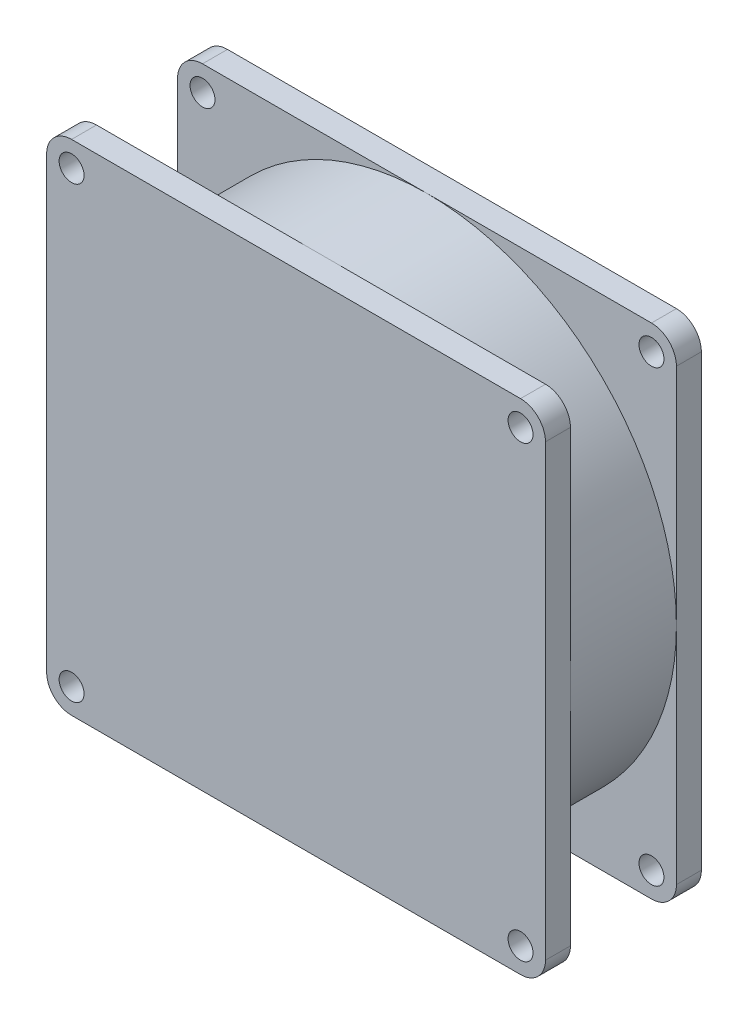
ISO-10303-21;
HEADER;
FILE_DESCRIPTION(('STEP AP214'),'2;1');
FILE_NAME('part.step','',(''),(''),'','','');
FILE_SCHEMA(('AUTOMOTIVE_DESIGN { 1 0 10303 214 1 1 1 1 }'));
ENDSEC;
DATA;
#1=APPLICATION_CONTEXT('core data for automotive mechanical design processes');
#2=APPLICATION_PROTOCOL_DEFINITION('international standard','automotive_design',2000,#1);
#3=PRODUCT_CONTEXT('',#1,'mechanical');
#4=PRODUCT('Part','Part','',(#3));
#5=PRODUCT_RELATED_PRODUCT_CATEGORY('part','',(#4));
#6=PRODUCT_DEFINITION_FORMATION('','',#4);
#7=PRODUCT_DEFINITION_CONTEXT('part definition',#1,'design');
#8=PRODUCT_DEFINITION('design','',#6,#7);
#9=PRODUCT_DEFINITION_SHAPE('','',#8);
#10=(LENGTH_UNIT() NAMED_UNIT(*) SI_UNIT(.MILLI.,.METRE.));
#11=(NAMED_UNIT(*) PLANE_ANGLE_UNIT() SI_UNIT($,.RADIAN.));
#12=(NAMED_UNIT(*) SI_UNIT($,.STERADIAN.) SOLID_ANGLE_UNIT());
#13=UNCERTAINTY_MEASURE_WITH_UNIT(LENGTH_MEASURE(1.E-05),#10,'distance_accuracy_value','');
#14=(GEOMETRIC_REPRESENTATION_CONTEXT(3) GLOBAL_UNCERTAINTY_ASSIGNED_CONTEXT((#13)) GLOBAL_UNIT_ASSIGNED_CONTEXT((#10,
#11,#12)) REPRESENTATION_CONTEXT('',''));
#15=CARTESIAN_POINT('',(0.,0.,0.));
#16=DIRECTION('',(0.,0.,1.));
#17=DIRECTION('',(1.,0.,0.));
#18=AXIS2_PLACEMENT_3D('',#15,#16,#17);
#19=CARTESIAN_POINT('',(0.,0.,4.));
#20=DIRECTION('',(0.,0.,1.));
#21=DIRECTION('',(1.,0.,0.));
#22=AXIS2_PLACEMENT_3D('',#19,#20,#21);
#23=PLANE('',#22);
#24=CARTESIAN_POINT('',(76.,76.,4.));
#25=DIRECTION('',(0.,0.,1.));
#26=DIRECTION('',(1.,0.,0.));
#27=AXIS2_PLACEMENT_3D('',#24,#25,#26);
#28=CIRCLE('',#27,1.99999999999999);
#29=CARTESIAN_POINT('',(78.,76.,4.));
#30=VERTEX_POINT('',#29);
#31=EDGE_CURVE('E41',#30,#30,#28,.T.);
#32=ORIENTED_EDGE('',*,*,#31,.F.);
#33=EDGE_LOOP('',(#32));
#34=FACE_BOUND('',#33,.T.);
#35=CARTESIAN_POINT('',(40.,40.,4.));
#36=DIRECTION('',(0.,0.,1.));
#37=DIRECTION('',(1.,0.,0.));
#38=AXIS2_PLACEMENT_3D('',#35,#36,#37);
#39=CIRCLE('',#38,40.);
#40=CARTESIAN_POINT('',(80.,40.,4.));
#41=VERTEX_POINT('',#40);
#42=CARTESIAN_POINT('',(40.,80.,4.));
#43=VERTEX_POINT('',#42);
#44=EDGE_CURVE('E212',#41,#43,#39,.T.);
#45=ORIENTED_EDGE('',*,*,#44,.F.);
#46=DIRECTION('',(0.,1.,0.));
#47=VECTOR('',#46,1.);
#48=CARTESIAN_POINT('',(80.,0.,4.));
#49=LINE('',#48,#47);
#50=CARTESIAN_POINT('',(80.,76.,4.));
#51=VERTEX_POINT('',#50);
#52=EDGE_CURVE('E230',#41,#51,#49,.T.);
#53=ORIENTED_EDGE('',*,*,#52,.T.);
#54=CARTESIAN_POINT('',(76.,76.,4.));
#55=DIRECTION('',(0.,0.,1.));
#56=DIRECTION('',(1.,0.,0.));
#57=AXIS2_PLACEMENT_3D('',#54,#55,#56);
#58=CIRCLE('',#57,4.);
#59=CARTESIAN_POINT('',(76.,80.,4.));
#60=VERTEX_POINT('',#59);
#61=EDGE_CURVE('E271',#51,#60,#58,.T.);
#62=ORIENTED_EDGE('',*,*,#61,.T.);
#63=DIRECTION('',(1.,0.,0.));
#64=VECTOR('',#63,1.);
#65=CARTESIAN_POINT('',(0.,80.,4.));
#66=LINE('',#65,#64);
#67=EDGE_CURVE('E234',#43,#60,#66,.T.);
#68=ORIENTED_EDGE('',*,*,#67,.F.);
#69=EDGE_LOOP('',(#45,#53,#62,#68));
#70=FACE_BOUND('',#69,.T.);
#71=ADVANCED_FACE('F37',(#34,#70),#23,.T.);
#72=CARTESIAN_POINT('',(4.,76.,4.));
#73=DIRECTION('',(0.,0.,1.));
#74=DIRECTION('',(1.,0.,0.));
#75=AXIS2_PLACEMENT_3D('',#72,#73,#74);
#76=CIRCLE('',#75,2.);
#77=CARTESIAN_POINT('',(5.99999999999999,76.,4.));
#78=VERTEX_POINT('',#77);
#79=EDGE_CURVE('E330',#78,#78,#76,.T.);
#80=ORIENTED_EDGE('',*,*,#79,.F.);
#81=EDGE_LOOP('',(#80));
#82=FACE_BOUND('',#81,.T.);
#83=CARTESIAN_POINT('',(0.,40.,4.));
#84=VERTEX_POINT('',#83);
#85=EDGE_CURVE('E225',#43,#84,#39,.T.);
#86=ORIENTED_EDGE('',*,*,#85,.F.);
#87=CARTESIAN_POINT('',(4.,80.,4.));
#88=VERTEX_POINT('',#87);
#89=EDGE_CURVE('E235',#88,#43,#66,.T.);
#90=ORIENTED_EDGE('',*,*,#89,.F.);
#91=CARTESIAN_POINT('',(4.,76.,4.));
#92=DIRECTION('',(0.,0.,1.));
#93=DIRECTION('',(1.,0.,0.));
#94=AXIS2_PLACEMENT_3D('',#91,#92,#93);
#95=CIRCLE('',#94,4.);
#96=CARTESIAN_POINT('',(0.,76.,4.));
#97=VERTEX_POINT('',#96);
#98=EDGE_CURVE('E278',#88,#97,#95,.T.);
#99=ORIENTED_EDGE('',*,*,#98,.T.);
#100=DIRECTION('',(0.,1.,0.));
#101=VECTOR('',#100,1.);
#102=CARTESIAN_POINT('',(0.,0.,4.));
#103=LINE('',#102,#101);
#104=EDGE_CURVE('E238',#84,#97,#103,.T.);
#105=ORIENTED_EDGE('',*,*,#104,.F.);
#106=EDGE_LOOP('',(#86,#90,#99,#105));
#107=FACE_BOUND('',#106,.T.);
#108=ADVANCED_FACE('F418',(#82,#107),#23,.T.);
#109=CARTESIAN_POINT('',(4.,4.,4.));
#110=DIRECTION('',(0.,0.,1.));
#111=DIRECTION('',(1.,0.,0.));
#112=AXIS2_PLACEMENT_3D('',#109,#110,#111);
#113=CIRCLE('',#112,2.);
#114=CARTESIAN_POINT('',(5.99999999999999,4.,4.));
#115=VERTEX_POINT('',#114);
#116=EDGE_CURVE('E328',#115,#115,#113,.T.);
#117=ORIENTED_EDGE('',*,*,#116,.F.);
#118=EDGE_LOOP('',(#117));
#119=FACE_BOUND('',#118,.T.);
#120=CARTESIAN_POINT('',(40.,0.,4.));
#121=VERTEX_POINT('',#120);
#122=EDGE_CURVE('E459',#84,#121,#39,.T.);
#123=ORIENTED_EDGE('',*,*,#122,.F.);
#124=CARTESIAN_POINT('',(0.,4.,4.));
#125=VERTEX_POINT('',#124);
#126=EDGE_CURVE('E239',#125,#84,#103,.T.);
#127=ORIENTED_EDGE('',*,*,#126,.F.);
#128=CARTESIAN_POINT('',(4.,4.,4.));
#129=DIRECTION('',(0.,0.,1.));
#130=DIRECTION('',(1.,0.,0.));
#131=AXIS2_PLACEMENT_3D('',#128,#129,#130);
#132=CIRCLE('',#131,4.);
#133=CARTESIAN_POINT('',(4.,0.,4.));
#134=VERTEX_POINT('',#133);
#135=EDGE_CURVE('E276',#125,#134,#132,.T.);
#136=ORIENTED_EDGE('',*,*,#135,.T.);
#137=DIRECTION('',(1.,0.,0.));
#138=VECTOR('',#137,1.);
#139=CARTESIAN_POINT('',(0.,0.,4.));
#140=LINE('',#139,#138);
#141=EDGE_CURVE('E227',#134,#121,#140,.T.);
#142=ORIENTED_EDGE('',*,*,#141,.T.);
#143=EDGE_LOOP('',(#123,#127,#136,#142));
#144=FACE_BOUND('',#143,.T.);
#145=ADVANCED_FACE('F425',(#119,#144),#23,.T.);
#146=CARTESIAN_POINT('',(0.,0.,4.));
#147=DIRECTION('',(0.,1.,0.));
#148=DIRECTION('',(0.,0.,1.));
#149=AXIS2_PLACEMENT_3D('',#146,#147,#148);
#150=PLANE('',#149);
#151=ORIENTED_EDGE('',*,*,#141,.F.);
#152=DIRECTION('',(0.,0.,-1.));
#153=VECTOR('',#152,1.);
#154=CARTESIAN_POINT('',(4.,0.,0.));
#155=LINE('',#154,#153);
#156=CARTESIAN_POINT('',(4.,0.,0.));
#157=VERTEX_POINT('',#156);
#158=EDGE_CURVE('E284',#134,#157,#155,.T.);
#159=ORIENTED_EDGE('',*,*,#158,.T.);
#160=DIRECTION('',(1.,0.,0.));
#161=VECTOR('',#160,1.);
#162=CARTESIAN_POINT('',(0.,0.,0.));
#163=LINE('',#162,#161);
#164=CARTESIAN_POINT('',(76.,0.,0.));
#165=VERTEX_POINT('',#164);
#166=EDGE_CURVE('E205',#157,#165,#163,.T.);
#167=ORIENTED_EDGE('',*,*,#166,.T.);
#168=DIRECTION('',(0.,0.,-1.));
#169=VECTOR('',#168,1.);
#170=CARTESIAN_POINT('',(76.,0.,4.));
#171=LINE('',#170,#169);
#172=CARTESIAN_POINT('',(76.,0.,4.));
#173=VERTEX_POINT('',#172);
#174=EDGE_CURVE('E281',#165,#173,#171,.F.);
#175=ORIENTED_EDGE('',*,*,#174,.T.);
#176=EDGE_CURVE('E231',#121,#173,#140,.T.);
#177=ORIENTED_EDGE('',*,*,#176,.F.);
#178=EDGE_LOOP('',(#151,#159,#167,#175,#177));
#179=FACE_BOUND('',#178,.T.);
#180=ADVANCED_FACE('F447',(#179),#150,.F.);
#181=CARTESIAN_POINT('',(80.,0.,4.));
#182=DIRECTION('',(-1.,0.,0.));
#183=DIRECTION('',(0.,0.,1.));
#184=AXIS2_PLACEMENT_3D('',#181,#182,#183);
#185=PLANE('',#184);
#186=CARTESIAN_POINT('',(80.,4.,4.));
#187=VERTEX_POINT('',#186);
#188=EDGE_CURVE('E232',#187,#41,#49,.T.);
#189=ORIENTED_EDGE('',*,*,#188,.F.);
#190=DIRECTION('',(0.,0.,-1.));
#191=VECTOR('',#190,1.);
#192=CARTESIAN_POINT('',(80.,4.,4.));
#193=LINE('',#192,#191);
#194=CARTESIAN_POINT('',(80.,4.,0.));
#195=VERTEX_POINT('',#194);
#196=EDGE_CURVE('E290',#187,#195,#193,.T.);
#197=ORIENTED_EDGE('',*,*,#196,.T.);
#198=DIRECTION('',(0.,1.,0.));
#199=VECTOR('',#198,1.);
#200=CARTESIAN_POINT('',(80.,0.,0.));
#201=LINE('',#200,#199);
#202=CARTESIAN_POINT('',(80.,76.,0.));
#203=VERTEX_POINT('',#202);
#204=EDGE_CURVE('E245',#195,#203,#201,.T.);
#205=ORIENTED_EDGE('',*,*,#204,.T.);
#206=DIRECTION('',(0.,0.,-1.));
#207=VECTOR('',#206,1.);
#208=CARTESIAN_POINT('',(80.,76.,4.));
#209=LINE('',#208,#207);
#210=EDGE_CURVE('E287',#203,#51,#209,.F.);
#211=ORIENTED_EDGE('',*,*,#210,.T.);
#212=ORIENTED_EDGE('',*,*,#52,.F.);
#213=EDGE_LOOP('',(#189,#197,#205,#211,#212));
#214=FACE_BOUND('',#213,.T.);
#215=ADVANCED_FACE('F452',(#214),#185,.F.);
#216=CARTESIAN_POINT('',(0.,80.,4.));
#217=DIRECTION('',(0.,1.,0.));
#218=DIRECTION('',(0.,0.,1.));
#219=AXIS2_PLACEMENT_3D('',#216,#217,#218);
#220=PLANE('',#219);
#221=DIRECTION('',(1.,0.,0.));
#222=VECTOR('',#221,1.);
#223=CARTESIAN_POINT('',(0.,80.,0.));
#224=LINE('',#223,#222);
#225=CARTESIAN_POINT('',(4.,80.,0.));
#226=VERTEX_POINT('',#225);
#227=CARTESIAN_POINT('',(76.,80.,0.));
#228=VERTEX_POINT('',#227);
#229=EDGE_CURVE('E248',#226,#228,#224,.T.);
#230=ORIENTED_EDGE('',*,*,#229,.F.);
#231=DIRECTION('',(0.,0.,-1.));
#232=VECTOR('',#231,1.);
#233=CARTESIAN_POINT('',(4.,80.,4.));
#234=LINE('',#233,#232);
#235=EDGE_CURVE('E269',#226,#88,#234,.F.);
#236=ORIENTED_EDGE('',*,*,#235,.T.);
#237=ORIENTED_EDGE('',*,*,#89,.T.);
#238=ORIENTED_EDGE('',*,*,#67,.T.);
#239=DIRECTION('',(0.,0.,-1.));
#240=VECTOR('',#239,1.);
#241=CARTESIAN_POINT('',(76.,80.,0.));
#242=LINE('',#241,#240);
#243=EDGE_CURVE('E266',#60,#228,#242,.T.);
#244=ORIENTED_EDGE('',*,*,#243,.T.);
#245=EDGE_LOOP('',(#230,#236,#237,#238,#244));
#246=FACE_BOUND('',#245,.T.);
#247=ADVANCED_FACE('F441',(#246),#220,.T.);
#248=CARTESIAN_POINT('',(0.,0.,4.));
#249=DIRECTION('',(-1.,0.,0.));
#250=DIRECTION('',(0.,0.,1.));
#251=AXIS2_PLACEMENT_3D('',#248,#249,#250);
#252=PLANE('',#251);
#253=ORIENTED_EDGE('',*,*,#126,.T.);
#254=ORIENTED_EDGE('',*,*,#104,.T.);
#255=DIRECTION('',(0.,0.,-1.));
#256=VECTOR('',#255,1.);
#257=CARTESIAN_POINT('',(0.,76.,4.));
#258=LINE('',#257,#256);
#259=CARTESIAN_POINT('',(0.,76.,0.));
#260=VERTEX_POINT('',#259);
#261=EDGE_CURVE('E255',#97,#260,#258,.T.);
#262=ORIENTED_EDGE('',*,*,#261,.T.);
#263=DIRECTION('',(0.,1.,0.));
#264=VECTOR('',#263,1.);
#265=CARTESIAN_POINT('',(0.,0.,0.));
#266=LINE('',#265,#264);
#267=CARTESIAN_POINT('',(0.,4.,0.));
#268=VERTEX_POINT('',#267);
#269=EDGE_CURVE('E251',#268,#260,#266,.T.);
#270=ORIENTED_EDGE('',*,*,#269,.F.);
#271=DIRECTION('',(0.,0.,-1.));
#272=VECTOR('',#271,1.);
#273=CARTESIAN_POINT('',(0.,4.,4.));
#274=LINE('',#273,#272);
#275=EDGE_CURVE('E242',#268,#125,#274,.F.);
#276=ORIENTED_EDGE('',*,*,#275,.T.);
#277=EDGE_LOOP('',(#253,#254,#262,#270,#276));
#278=FACE_BOUND('',#277,.T.);
#279=ADVANCED_FACE('F433',(#278),#252,.T.);
#280=CARTESIAN_POINT('',(76.,4.,4.));
#281=DIRECTION('',(0.,0.,1.));
#282=DIRECTION('',(1.,0.,0.));
#283=AXIS2_PLACEMENT_3D('',#280,#281,#282);
#284=CIRCLE('',#283,1.99999999999999);
#285=CARTESIAN_POINT('',(78.,4.,4.));
#286=VERTEX_POINT('',#285);
#287=EDGE_CURVE('E324',#286,#286,#284,.T.);
#288=ORIENTED_EDGE('',*,*,#287,.F.);
#289=EDGE_LOOP('',(#288));
#290=FACE_BOUND('',#289,.T.);
#291=EDGE_CURVE('E226',#121,#41,#39,.T.);
#292=ORIENTED_EDGE('',*,*,#291,.F.);
#293=ORIENTED_EDGE('',*,*,#176,.T.);
#294=CARTESIAN_POINT('',(76.,4.,4.));
#295=DIRECTION('',(0.,0.,1.));
#296=DIRECTION('',(1.,0.,0.));
#297=AXIS2_PLACEMENT_3D('',#294,#295,#296);
#298=CIRCLE('',#297,4.);
#299=EDGE_CURVE('E274',#173,#187,#298,.T.);
#300=ORIENTED_EDGE('',*,*,#299,.T.);
#301=ORIENTED_EDGE('',*,*,#188,.T.);
#302=EDGE_LOOP('',(#292,#293,#300,#301));
#303=FACE_BOUND('',#302,.T.);
#304=ADVANCED_FACE('F421',(#290,#303),#23,.T.);
#305=CARTESIAN_POINT('',(0.,0.,0.));
#306=DIRECTION('',(0.,0.,1.));
#307=DIRECTION('',(1.,0.,0.));
#308=AXIS2_PLACEMENT_3D('',#305,#306,#307);
#309=PLANE('',#308);
#310=CARTESIAN_POINT('',(76.,76.,0.));
#311=DIRECTION('',(0.,0.,-1.));
#312=DIRECTION('',(-1.,0.,0.));
#313=AXIS2_PLACEMENT_3D('',#310,#311,#312);
#314=CIRCLE('',#313,2.);
#315=CARTESIAN_POINT('',(74.,76.,0.));
#316=VERTEX_POINT('',#315);
#317=EDGE_CURVE('E578',#316,#316,#314,.T.);
#318=ORIENTED_EDGE('',*,*,#317,.F.);
#319=EDGE_LOOP('',(#318));
#320=FACE_BOUND('',#319,.T.);
#321=CARTESIAN_POINT('',(4.,76.,0.));
#322=DIRECTION('',(0.,0.,-1.));
#323=DIRECTION('',(-1.,0.,0.));
#324=AXIS2_PLACEMENT_3D('',#321,#322,#323);
#325=CIRCLE('',#324,2.);
#326=CARTESIAN_POINT('',(2.,76.,0.));
#327=VERTEX_POINT('',#326);
#328=EDGE_CURVE('E340',#327,#327,#325,.T.);
#329=ORIENTED_EDGE('',*,*,#328,.F.);
#330=EDGE_LOOP('',(#329));
#331=FACE_BOUND('',#330,.T.);
#332=CARTESIAN_POINT('',(4.,4.,0.));
#333=DIRECTION('',(0.,0.,-1.));
#334=DIRECTION('',(-1.,0.,0.));
#335=AXIS2_PLACEMENT_3D('',#332,#333,#334);
#336=CIRCLE('',#335,2.);
#337=CARTESIAN_POINT('',(2.,4.,0.));
#338=VERTEX_POINT('',#337);
#339=EDGE_CURVE('E337',#338,#338,#336,.T.);
#340=ORIENTED_EDGE('',*,*,#339,.F.);
#341=EDGE_LOOP('',(#340));
#342=FACE_BOUND('',#341,.T.);
#343=CARTESIAN_POINT('',(76.,4.,0.));
#344=DIRECTION('',(0.,0.,-1.));
#345=DIRECTION('',(-1.,0.,0.));
#346=AXIS2_PLACEMENT_3D('',#343,#344,#345);
#347=CIRCLE('',#346,2.);
#348=CARTESIAN_POINT('',(74.,4.,0.));
#349=VERTEX_POINT('',#348);
#350=EDGE_CURVE('E355',#349,#349,#347,.T.);
#351=ORIENTED_EDGE('',*,*,#350,.F.);
#352=EDGE_LOOP('',(#351));
#353=FACE_BOUND('',#352,.T.);
#354=ORIENTED_EDGE('',*,*,#269,.T.);
#355=CARTESIAN_POINT('',(4.,76.,0.));
#356=DIRECTION('',(0.,0.,1.));
#357=DIRECTION('',(1.,0.,0.));
#358=AXIS2_PLACEMENT_3D('',#355,#356,#357);
#359=CIRCLE('',#358,4.);
#360=EDGE_CURVE('E264',#260,#226,#359,.F.);
#361=ORIENTED_EDGE('',*,*,#360,.T.);
#362=ORIENTED_EDGE('',*,*,#229,.T.);
#363=CARTESIAN_POINT('',(76.,76.,0.));
#364=DIRECTION('',(0.,0.,1.));
#365=DIRECTION('',(1.,0.,0.));
#366=AXIS2_PLACEMENT_3D('',#363,#364,#365);
#367=CIRCLE('',#366,4.);
#368=EDGE_CURVE('E258',#228,#203,#367,.F.);
#369=ORIENTED_EDGE('',*,*,#368,.T.);
#370=ORIENTED_EDGE('',*,*,#204,.F.);
#371=CARTESIAN_POINT('',(76.,4.,0.));
#372=DIRECTION('',(0.,0.,1.));
#373=DIRECTION('',(1.,0.,0.));
#374=AXIS2_PLACEMENT_3D('',#371,#372,#373);
#375=CIRCLE('',#374,4.);
#376=EDGE_CURVE('E260',#195,#165,#375,.F.);
#377=ORIENTED_EDGE('',*,*,#376,.T.);
#378=ORIENTED_EDGE('',*,*,#166,.F.);
#379=CARTESIAN_POINT('',(4.,4.,0.));
#380=DIRECTION('',(0.,0.,1.));
#381=DIRECTION('',(1.,0.,0.));
#382=AXIS2_PLACEMENT_3D('',#379,#380,#381);
#383=CIRCLE('',#382,4.);
#384=EDGE_CURVE('E262',#157,#268,#383,.F.);
#385=ORIENTED_EDGE('',*,*,#384,.T.);
#386=EDGE_LOOP('',(#354,#361,#362,#369,#370,#377,#378,#385));
#387=FACE_BOUND('',#386,.T.);
#388=ADVANCED_FACE('F432',(#320,#331,#342,#353,#387),#309,.F.);
#389=CARTESIAN_POINT('',(4.,76.,4.));
#390=DIRECTION('',(0.,0.,-1.));
#391=DIRECTION('',(-1.,0.,0.));
#392=AXIS2_PLACEMENT_3D('',#389,#390,#391);
#393=CYLINDRICAL_SURFACE('',#392,4.);
#394=ORIENTED_EDGE('',*,*,#98,.F.);
#395=ORIENTED_EDGE('',*,*,#235,.F.);
#396=ORIENTED_EDGE('',*,*,#360,.F.);
#397=ORIENTED_EDGE('',*,*,#261,.F.);
#398=EDGE_LOOP('',(#394,#395,#396,#397));
#399=FACE_BOUND('',#398,.T.);
#400=ADVANCED_FACE('F439',(#399),#393,.T.);
#401=CARTESIAN_POINT('',(4.,4.,4.));
#402=DIRECTION('',(0.,0.,1.));
#403=DIRECTION('',(1.,0.,0.));
#404=AXIS2_PLACEMENT_3D('',#401,#402,#403);
#405=CYLINDRICAL_SURFACE('',#404,4.);
#406=ORIENTED_EDGE('',*,*,#135,.F.);
#407=ORIENTED_EDGE('',*,*,#275,.F.);
#408=ORIENTED_EDGE('',*,*,#384,.F.);
#409=ORIENTED_EDGE('',*,*,#158,.F.);
#410=EDGE_LOOP('',(#406,#407,#408,#409));
#411=FACE_BOUND('',#410,.T.);
#412=ADVANCED_FACE('F484',(#411),#405,.T.);
#413=CARTESIAN_POINT('',(76.,4.,4.));
#414=DIRECTION('',(0.,0.,-1.));
#415=DIRECTION('',(-1.,0.,0.));
#416=AXIS2_PLACEMENT_3D('',#413,#414,#415);
#417=CYLINDRICAL_SURFACE('',#416,4.);
#418=ORIENTED_EDGE('',*,*,#299,.F.);
#419=ORIENTED_EDGE('',*,*,#174,.F.);
#420=ORIENTED_EDGE('',*,*,#376,.F.);
#421=ORIENTED_EDGE('',*,*,#196,.F.);
#422=EDGE_LOOP('',(#418,#419,#420,#421));
#423=FACE_BOUND('',#422,.T.);
#424=ADVANCED_FACE('F496',(#423),#417,.T.);
#425=CARTESIAN_POINT('',(76.,76.,4.));
#426=DIRECTION('',(0.,0.,1.));
#427=DIRECTION('',(1.,0.,0.));
#428=AXIS2_PLACEMENT_3D('',#425,#426,#427);
#429=CYLINDRICAL_SURFACE('',#428,4.);
#430=ORIENTED_EDGE('',*,*,#61,.F.);
#431=ORIENTED_EDGE('',*,*,#210,.F.);
#432=ORIENTED_EDGE('',*,*,#368,.F.);
#433=ORIENTED_EDGE('',*,*,#243,.F.);
#434=EDGE_LOOP('',(#430,#431,#432,#433));
#435=FACE_BOUND('',#434,.T.);
#436=ADVANCED_FACE('F494',(#435),#429,.T.);
#437=CARTESIAN_POINT('',(40.,40.,21.));
#438=DIRECTION('',(0.,0.,-1.));
#439=DIRECTION('',(-1.,0.,0.));
#440=AXIS2_PLACEMENT_3D('',#437,#438,#439);
#441=CYLINDRICAL_SURFACE('',#440,40.);
#442=CARTESIAN_POINT('',(40.,40.,21.));
#443=DIRECTION('',(0.,0.,1.));
#444=DIRECTION('',(1.,0.,0.));
#445=AXIS2_PLACEMENT_3D('',#442,#443,#444);
#446=CIRCLE('',#445,40.);
#447=CARTESIAN_POINT('',(80.,40.,21.));
#448=VERTEX_POINT('',#447);
#449=CARTESIAN_POINT('',(40.,80.,21.));
#450=VERTEX_POINT('',#449);
#451=EDGE_CURVE('E194',#448,#450,#446,.T.);
#452=ORIENTED_EDGE('',*,*,#451,.F.);
#453=CARTESIAN_POINT('',(40.,0.,21.));
#454=VERTEX_POINT('',#453);
#455=EDGE_CURVE('E198',#454,#448,#446,.T.);
#456=ORIENTED_EDGE('',*,*,#455,.F.);
#457=CARTESIAN_POINT('',(0.,40.,21.));
#458=VERTEX_POINT('',#457);
#459=EDGE_CURVE('E211',#458,#454,#446,.T.);
#460=ORIENTED_EDGE('',*,*,#459,.F.);
#461=EDGE_CURVE('E201',#450,#458,#446,.T.);
#462=ORIENTED_EDGE('',*,*,#461,.F.);
#463=EDGE_LOOP('',(#452,#456,#460,#462));
#464=FACE_BOUND('',#463,.T.);
#465=ORIENTED_EDGE('',*,*,#44,.T.);
#466=ORIENTED_EDGE('',*,*,#85,.T.);
#467=ORIENTED_EDGE('',*,*,#122,.T.);
#468=ORIENTED_EDGE('',*,*,#291,.T.);
#469=EDGE_LOOP('',(#465,#466,#467,#468));
#470=FACE_BOUND('',#469,.T.);
#471=ADVANCED_FACE('F195',(#464,#470),#441,.T.);
#472=CARTESIAN_POINT('',(0.,0.,21.));
#473=DIRECTION('',(0.,0.,-1.));
#474=DIRECTION('',(-1.,0.,0.));
#475=AXIS2_PLACEMENT_3D('',#472,#473,#474);
#476=PLANE('',#475);
#477=CARTESIAN_POINT('',(76.,76.,21.));
#478=DIRECTION('',(0.,0.,-1.));
#479=DIRECTION('',(-1.,0.,0.));
#480=AXIS2_PLACEMENT_3D('',#477,#478,#479);
#481=CIRCLE('',#480,1.99999999999999);
#482=CARTESIAN_POINT('',(74.,76.,21.));
#483=VERTEX_POINT('',#482);
#484=EDGE_CURVE('E345',#483,#483,#481,.T.);
#485=ORIENTED_EDGE('',*,*,#484,.F.);
#486=EDGE_LOOP('',(#485));
#487=FACE_BOUND('',#486,.T.);
#488=DIRECTION('',(-1.,0.,0.));
#489=VECTOR('',#488,1.);
#490=CARTESIAN_POINT('',(0.,80.,21.));
#491=LINE('',#490,#489);
#492=CARTESIAN_POINT('',(76.,80.,21.));
#493=VERTEX_POINT('',#492);
#494=EDGE_CURVE('E219',#493,#450,#491,.T.);
#495=ORIENTED_EDGE('',*,*,#494,.F.);
#496=CARTESIAN_POINT('',(76.,76.,21.));
#497=DIRECTION('',(0.,0.,-1.));
#498=DIRECTION('',(-1.,0.,0.));
#499=AXIS2_PLACEMENT_3D('',#496,#497,#498);
#500=CIRCLE('',#499,4.);
#501=CARTESIAN_POINT('',(80.,76.,21.));
#502=VERTEX_POINT('',#501);
#503=EDGE_CURVE('E214',#493,#502,#500,.T.);
#504=ORIENTED_EDGE('',*,*,#503,.T.);
#505=DIRECTION('',(0.,1.,0.));
#506=VECTOR('',#505,1.);
#507=CARTESIAN_POINT('',(80.,0.,21.));
#508=LINE('',#507,#506);
#509=EDGE_CURVE('E182',#448,#502,#508,.T.);
#510=ORIENTED_EDGE('',*,*,#509,.F.);
#511=ORIENTED_EDGE('',*,*,#451,.T.);
#512=EDGE_LOOP('',(#495,#504,#510,#511));
#513=FACE_BOUND('',#512,.T.);
#514=ADVANCED_FACE('F213',(#487,#513),#476,.T.);
#515=CARTESIAN_POINT('',(4.,76.,21.));
#516=DIRECTION('',(0.,0.,-1.));
#517=DIRECTION('',(-1.,0.,0.));
#518=AXIS2_PLACEMENT_3D('',#515,#516,#517);
#519=CIRCLE('',#518,2.);
#520=CARTESIAN_POINT('',(2.,76.,21.));
#521=VERTEX_POINT('',#520);
#522=EDGE_CURVE('E332',#521,#521,#519,.T.);
#523=ORIENTED_EDGE('',*,*,#522,.F.);
#524=EDGE_LOOP('',(#523));
#525=FACE_BOUND('',#524,.T.);
#526=DIRECTION('',(0.,-1.,0.));
#527=VECTOR('',#526,1.);
#528=CARTESIAN_POINT('',(0.,0.,21.));
#529=LINE('',#528,#527);
#530=CARTESIAN_POINT('',(0.,76.,21.));
#531=VERTEX_POINT('',#530);
#532=EDGE_CURVE('E372',#531,#458,#529,.T.);
#533=ORIENTED_EDGE('',*,*,#532,.F.);
#534=CARTESIAN_POINT('',(4.,76.,21.));
#535=DIRECTION('',(0.,0.,-1.));
#536=DIRECTION('',(-1.,0.,0.));
#537=AXIS2_PLACEMENT_3D('',#534,#535,#536);
#538=CIRCLE('',#537,4.);
#539=CARTESIAN_POINT('',(4.,80.,21.));
#540=VERTEX_POINT('',#539);
#541=EDGE_CURVE('E11',#531,#540,#538,.T.);
#542=ORIENTED_EDGE('',*,*,#541,.T.);
#543=EDGE_CURVE('E188',#450,#540,#491,.T.);
#544=ORIENTED_EDGE('',*,*,#543,.F.);
#545=ORIENTED_EDGE('',*,*,#461,.T.);
#546=EDGE_LOOP('',(#533,#542,#544,#545));
#547=FACE_BOUND('',#546,.T.);
#548=ADVANCED_FACE('F401',(#525,#547),#476,.T.);
#549=CARTESIAN_POINT('',(4.,4.,21.));
#550=DIRECTION('',(0.,0.,-1.));
#551=DIRECTION('',(-1.,0.,0.));
#552=AXIS2_PLACEMENT_3D('',#549,#550,#551);
#553=CIRCLE('',#552,2.);
#554=CARTESIAN_POINT('',(2.,4.,21.));
#555=VERTEX_POINT('',#554);
#556=EDGE_CURVE('E326',#555,#555,#553,.T.);
#557=ORIENTED_EDGE('',*,*,#556,.F.);
#558=EDGE_LOOP('',(#557));
#559=FACE_BOUND('',#558,.T.);
#560=DIRECTION('',(1.,0.,0.));
#561=VECTOR('',#560,1.);
#562=CARTESIAN_POINT('',(0.,0.,21.));
#563=LINE('',#562,#561);
#564=CARTESIAN_POINT('',(4.,0.,21.));
#565=VERTEX_POINT('',#564);
#566=EDGE_CURVE('E215',#565,#454,#563,.T.);
#567=ORIENTED_EDGE('',*,*,#566,.F.);
#568=CARTESIAN_POINT('',(4.,4.,21.));
#569=DIRECTION('',(0.,0.,-1.));
#570=DIRECTION('',(-1.,0.,0.));
#571=AXIS2_PLACEMENT_3D('',#568,#569,#570);
#572=CIRCLE('',#571,4.);
#573=CARTESIAN_POINT('',(0.,4.,21.));
#574=VERTEX_POINT('',#573);
#575=EDGE_CURVE('E60',#565,#574,#572,.T.);
#576=ORIENTED_EDGE('',*,*,#575,.T.);
#577=EDGE_CURVE('E362',#458,#574,#529,.T.);
#578=ORIENTED_EDGE('',*,*,#577,.F.);
#579=ORIENTED_EDGE('',*,*,#459,.T.);
#580=EDGE_LOOP('',(#567,#576,#578,#579));
#581=FACE_BOUND('',#580,.T.);
#582=ADVANCED_FACE('F402',(#559,#581),#476,.T.);
#583=CARTESIAN_POINT('',(0.,0.,25.));
#584=DIRECTION('',(1.,0.,0.));
#585=DIRECTION('',(0.,0.,-1.));
#586=AXIS2_PLACEMENT_3D('',#583,#584,#585);
#587=PLANE('',#586);
#588=ORIENTED_EDGE('',*,*,#577,.T.);
#589=DIRECTION('',(0.,0.,-1.));
#590=VECTOR('',#589,1.);
#591=CARTESIAN_POINT('',(0.,4.,25.));
#592=LINE('',#591,#590);
#593=CARTESIAN_POINT('',(0.,4.,25.));
#594=VERTEX_POINT('',#593);
#595=EDGE_CURVE('E46',#574,#594,#592,.F.);
#596=ORIENTED_EDGE('',*,*,#595,.T.);
#597=DIRECTION('',(0.,-1.,0.));
#598=VECTOR('',#597,1.);
#599=CARTESIAN_POINT('',(0.,0.,25.));
#600=LINE('',#599,#598);
#601=CARTESIAN_POINT('',(0.,76.,25.));
#602=VERTEX_POINT('',#601);
#603=EDGE_CURVE('E220',#602,#594,#600,.T.);
#604=ORIENTED_EDGE('',*,*,#603,.F.);
#605=DIRECTION('',(0.,0.,-1.));
#606=VECTOR('',#605,1.);
#607=CARTESIAN_POINT('',(0.,76.,25.));
#608=LINE('',#607,#606);
#609=EDGE_CURVE('E318',#602,#531,#608,.T.);
#610=ORIENTED_EDGE('',*,*,#609,.T.);
#611=ORIENTED_EDGE('',*,*,#532,.T.);
#612=EDGE_LOOP('',(#588,#596,#604,#610,#611));
#613=FACE_BOUND('',#612,.T.);
#614=ADVANCED_FACE('F376',(#613),#587,.F.);
#615=CARTESIAN_POINT('',(0.,0.,25.));
#616=DIRECTION('',(0.,1.,0.));
#617=DIRECTION('',(0.,0.,1.));
#618=AXIS2_PLACEMENT_3D('',#615,#616,#617);
#619=PLANE('',#618);
#620=CARTESIAN_POINT('',(76.,0.,21.));
#621=VERTEX_POINT('',#620);
#622=EDGE_CURVE('E210',#454,#621,#563,.T.);
#623=ORIENTED_EDGE('',*,*,#622,.T.);
#624=DIRECTION('',(0.,0.,-1.));
#625=VECTOR('',#624,1.);
#626=CARTESIAN_POINT('',(76.,0.,25.));
#627=LINE('',#626,#625);
#628=CARTESIAN_POINT('',(76.,0.,25.));
#629=VERTEX_POINT('',#628);
#630=EDGE_CURVE('E301',#621,#629,#627,.F.);
#631=ORIENTED_EDGE('',*,*,#630,.T.);
#632=DIRECTION('',(1.,0.,0.));
#633=VECTOR('',#632,1.);
#634=CARTESIAN_POINT('',(0.,0.,25.));
#635=LINE('',#634,#633);
#636=CARTESIAN_POINT('',(4.,0.,25.));
#637=VERTEX_POINT('',#636);
#638=EDGE_CURVE('E365',#637,#629,#635,.T.);
#639=ORIENTED_EDGE('',*,*,#638,.F.);
#640=DIRECTION('',(0.,0.,-1.));
#641=VECTOR('',#640,1.);
#642=CARTESIAN_POINT('',(4.,0.,25.));
#643=LINE('',#642,#641);
#644=EDGE_CURVE('E298',#637,#565,#643,.T.);
#645=ORIENTED_EDGE('',*,*,#644,.T.);
#646=ORIENTED_EDGE('',*,*,#566,.T.);
#647=EDGE_LOOP('',(#623,#631,#639,#645,#646));
#648=FACE_BOUND('',#647,.T.);
#649=ADVANCED_FACE('F387',(#648),#619,.F.);
#650=CARTESIAN_POINT('',(80.,0.,25.));
#651=DIRECTION('',(-1.,0.,0.));
#652=DIRECTION('',(0.,0.,1.));
#653=AXIS2_PLACEMENT_3D('',#650,#651,#652);
#654=PLANE('',#653);
#655=DIRECTION('',(0.,1.,0.));
#656=VECTOR('',#655,1.);
#657=CARTESIAN_POINT('',(80.,0.,25.));
#658=LINE('',#657,#656);
#659=CARTESIAN_POINT('',(80.,4.,25.));
#660=VERTEX_POINT('',#659);
#661=CARTESIAN_POINT('',(80.,76.,25.));
#662=VERTEX_POINT('',#661);
#663=EDGE_CURVE('E368',#660,#662,#658,.T.);
#664=ORIENTED_EDGE('',*,*,#663,.F.);
#665=DIRECTION('',(0.,0.,-1.));
#666=VECTOR('',#665,1.);
#667=CARTESIAN_POINT('',(80.,4.,25.));
#668=LINE('',#667,#666);
#669=CARTESIAN_POINT('',(80.,4.,21.));
#670=VERTEX_POINT('',#669);
#671=EDGE_CURVE('E185',#660,#670,#668,.T.);
#672=ORIENTED_EDGE('',*,*,#671,.T.);
#673=EDGE_CURVE('E177',#670,#448,#508,.T.);
#674=ORIENTED_EDGE('',*,*,#673,.T.);
#675=ORIENTED_EDGE('',*,*,#509,.T.);
#676=DIRECTION('',(0.,0.,-1.));
#677=VECTOR('',#676,1.);
#678=CARTESIAN_POINT('',(80.,76.,25.));
#679=LINE('',#678,#677);
#680=EDGE_CURVE('E293',#502,#662,#679,.F.);
#681=ORIENTED_EDGE('',*,*,#680,.T.);
#682=EDGE_LOOP('',(#664,#672,#674,#675,#681));
#683=FACE_BOUND('',#682,.T.);
#684=ADVANCED_FACE('F180',(#683),#654,.F.);
#685=CARTESIAN_POINT('',(0.,80.,25.));
#686=DIRECTION('',(0.,-1.,0.));
#687=DIRECTION('',(0.,0.,-1.));
#688=AXIS2_PLACEMENT_3D('',#685,#686,#687);
#689=PLANE('',#688);
#690=DIRECTION('',(-1.,0.,0.));
#691=VECTOR('',#690,1.);
#692=CARTESIAN_POINT('',(0.,80.,25.));
#693=LINE('',#692,#691);
#694=CARTESIAN_POINT('',(76.,80.,25.));
#695=VERTEX_POINT('',#694);
#696=CARTESIAN_POINT('',(4.,80.,25.));
#697=VERTEX_POINT('',#696);
#698=EDGE_CURVE('E224',#695,#697,#693,.T.);
#699=ORIENTED_EDGE('',*,*,#698,.F.);
#700=DIRECTION('',(0.,0.,-1.));
#701=VECTOR('',#700,1.);
#702=CARTESIAN_POINT('',(76.,80.,25.));
#703=LINE('',#702,#701);
#704=EDGE_CURVE('E313',#695,#493,#703,.T.);
#705=ORIENTED_EDGE('',*,*,#704,.T.);
#706=ORIENTED_EDGE('',*,*,#494,.T.);
#707=ORIENTED_EDGE('',*,*,#543,.T.);
#708=DIRECTION('',(0.,0.,-1.));
#709=VECTOR('',#708,1.);
#710=CARTESIAN_POINT('',(4.,80.,25.));
#711=LINE('',#710,#709);
#712=EDGE_CURVE('E311',#540,#697,#711,.F.);
#713=ORIENTED_EDGE('',*,*,#712,.T.);
#714=EDGE_LOOP('',(#699,#705,#706,#707,#713));
#715=FACE_BOUND('',#714,.T.);
#716=ADVANCED_FACE('F398',(#715),#689,.F.);
#717=CARTESIAN_POINT('',(0.,0.,25.));
#718=DIRECTION('',(0.,0.,-1.));
#719=DIRECTION('',(-1.,0.,0.));
#720=AXIS2_PLACEMENT_3D('',#717,#718,#719);
#721=PLANE('',#720);
#722=CARTESIAN_POINT('',(76.,76.,25.));
#723=DIRECTION('',(0.,0.,-1.));
#724=DIRECTION('',(-1.,0.,0.));
#725=AXIS2_PLACEMENT_3D('',#722,#723,#724);
#726=CIRCLE('',#725,1.99999999999999);
#727=CARTESIAN_POINT('',(74.,76.,25.));
#728=VERTEX_POINT('',#727);
#729=EDGE_CURVE('E536',#728,#728,#726,.T.);
#730=ORIENTED_EDGE('',*,*,#729,.T.);
#731=EDGE_LOOP('',(#730));
#732=FACE_BOUND('',#731,.T.);
#733=CARTESIAN_POINT('',(4.,76.,25.));
#734=DIRECTION('',(0.,0.,-1.));
#735=DIRECTION('',(-1.,0.,0.));
#736=AXIS2_PLACEMENT_3D('',#733,#734,#735);
#737=CIRCLE('',#736,1.99999999999999);
#738=CARTESIAN_POINT('',(2.00000000000001,76.,25.));
#739=VERTEX_POINT('',#738);
#740=EDGE_CURVE('E333',#739,#739,#737,.T.);
#741=ORIENTED_EDGE('',*,*,#740,.T.);
#742=EDGE_LOOP('',(#741));
#743=FACE_BOUND('',#742,.T.);
#744=CARTESIAN_POINT('',(4.,4.,25.));
#745=DIRECTION('',(0.,0.,-1.));
#746=DIRECTION('',(-1.,0.,0.));
#747=AXIS2_PLACEMENT_3D('',#744,#745,#746);
#748=CIRCLE('',#747,1.99999999999999);
#749=CARTESIAN_POINT('',(2.00000000000001,4.,25.));
#750=VERTEX_POINT('',#749);
#751=EDGE_CURVE('E329',#750,#750,#748,.T.);
#752=ORIENTED_EDGE('',*,*,#751,.T.);
#753=EDGE_LOOP('',(#752));
#754=FACE_BOUND('',#753,.T.);
#755=CARTESIAN_POINT('',(76.,4.,25.));
#756=DIRECTION('',(0.,0.,-1.));
#757=DIRECTION('',(-1.,0.,0.));
#758=AXIS2_PLACEMENT_3D('',#755,#756,#757);
#759=CIRCLE('',#758,1.99999999999999);
#760=CARTESIAN_POINT('',(74.,4.,25.));
#761=VERTEX_POINT('',#760);
#762=EDGE_CURVE('E325',#761,#761,#759,.T.);
#763=ORIENTED_EDGE('',*,*,#762,.T.);
#764=EDGE_LOOP('',(#763));
#765=FACE_BOUND('',#764,.T.);
#766=ORIENTED_EDGE('',*,*,#638,.T.);
#767=CARTESIAN_POINT('',(76.,4.,25.));
#768=DIRECTION('',(0.,0.,-1.));
#769=DIRECTION('',(-1.,0.,0.));
#770=AXIS2_PLACEMENT_3D('',#767,#768,#769);
#771=CIRCLE('',#770,4.);
#772=EDGE_CURVE('E309',#629,#660,#771,.F.);
#773=ORIENTED_EDGE('',*,*,#772,.T.);
#774=ORIENTED_EDGE('',*,*,#663,.T.);
#775=CARTESIAN_POINT('',(76.,76.,25.));
#776=DIRECTION('',(0.,0.,-1.));
#777=DIRECTION('',(-1.,0.,0.));
#778=AXIS2_PLACEMENT_3D('',#775,#776,#777);
#779=CIRCLE('',#778,4.);
#780=EDGE_CURVE('E307',#662,#695,#779,.F.);
#781=ORIENTED_EDGE('',*,*,#780,.T.);
#782=ORIENTED_EDGE('',*,*,#698,.T.);
#783=CARTESIAN_POINT('',(4.,76.,25.));
#784=DIRECTION('',(0.,0.,-1.));
#785=DIRECTION('',(-1.,0.,0.));
#786=AXIS2_PLACEMENT_3D('',#783,#784,#785);
#787=CIRCLE('',#786,4.);
#788=EDGE_CURVE('E303',#697,#602,#787,.F.);
#789=ORIENTED_EDGE('',*,*,#788,.T.);
#790=ORIENTED_EDGE('',*,*,#603,.T.);
#791=CARTESIAN_POINT('',(4.,4.,25.));
#792=DIRECTION('',(0.,0.,-1.));
#793=DIRECTION('',(-1.,0.,0.));
#794=AXIS2_PLACEMENT_3D('',#791,#792,#793);
#795=CIRCLE('',#794,4.);
#796=EDGE_CURVE('E305',#594,#637,#795,.F.);
#797=ORIENTED_EDGE('',*,*,#796,.T.);
#798=EDGE_LOOP('',(#766,#773,#774,#781,#782,#789,#790,#797));
#799=FACE_BOUND('',#798,.T.);
#800=ADVANCED_FACE('F384',(#732,#743,#754,#765,#799),#721,.F.);
#801=CARTESIAN_POINT('',(76.,4.,21.));
#802=DIRECTION('',(0.,0.,-1.));
#803=DIRECTION('',(-1.,0.,0.));
#804=AXIS2_PLACEMENT_3D('',#801,#802,#803);
#805=CIRCLE('',#804,1.99999999999999);
#806=CARTESIAN_POINT('',(74.,4.,21.));
#807=VERTEX_POINT('',#806);
#808=EDGE_CURVE('E321',#807,#807,#805,.T.);
#809=ORIENTED_EDGE('',*,*,#808,.F.);
#810=EDGE_LOOP('',(#809));
#811=FACE_BOUND('',#810,.T.);
#812=ORIENTED_EDGE('',*,*,#673,.F.);
#813=CARTESIAN_POINT('',(76.,4.,21.));
#814=DIRECTION('',(0.,0.,-1.));
#815=DIRECTION('',(-1.,0.,0.));
#816=AXIS2_PLACEMENT_3D('',#813,#814,#815);
#817=CIRCLE('',#816,4.);
#818=EDGE_CURVE('E296',#670,#621,#817,.T.);
#819=ORIENTED_EDGE('',*,*,#818,.T.);
#820=ORIENTED_EDGE('',*,*,#622,.F.);
#821=ORIENTED_EDGE('',*,*,#455,.T.);
#822=EDGE_LOOP('',(#812,#819,#820,#821));
#823=FACE_BOUND('',#822,.T.);
#824=ADVANCED_FACE('F208',(#811,#823),#476,.T.);
#825=CARTESIAN_POINT('',(76.,4.,25.));
#826=DIRECTION('',(0.,0.,-1.));
#827=DIRECTION('',(-1.,0.,0.));
#828=AXIS2_PLACEMENT_3D('',#825,#826,#827);
#829=CYLINDRICAL_SURFACE('',#828,4.);
#830=ORIENTED_EDGE('',*,*,#772,.F.);
#831=ORIENTED_EDGE('',*,*,#630,.F.);
#832=ORIENTED_EDGE('',*,*,#818,.F.);
#833=ORIENTED_EDGE('',*,*,#671,.F.);
#834=EDGE_LOOP('',(#830,#831,#832,#833));
#835=FACE_BOUND('',#834,.T.);
#836=ADVANCED_FACE('F390',(#835),#829,.T.);
#837=CARTESIAN_POINT('',(76.,76.,25.));
#838=DIRECTION('',(0.,0.,-1.));
#839=DIRECTION('',(-1.,0.,0.));
#840=AXIS2_PLACEMENT_3D('',#837,#838,#839);
#841=CYLINDRICAL_SURFACE('',#840,4.);
#842=ORIENTED_EDGE('',*,*,#780,.F.);
#843=ORIENTED_EDGE('',*,*,#680,.F.);
#844=ORIENTED_EDGE('',*,*,#503,.F.);
#845=ORIENTED_EDGE('',*,*,#704,.F.);
#846=EDGE_LOOP('',(#842,#843,#844,#845));
#847=FACE_BOUND('',#846,.T.);
#848=ADVANCED_FACE('F393',(#847),#841,.T.);
#849=CARTESIAN_POINT('',(4.,4.,25.));
#850=DIRECTION('',(0.,0.,-1.));
#851=DIRECTION('',(-1.,0.,0.));
#852=AXIS2_PLACEMENT_3D('',#849,#850,#851);
#853=CYLINDRICAL_SURFACE('',#852,4.);
#854=ORIENTED_EDGE('',*,*,#796,.F.);
#855=ORIENTED_EDGE('',*,*,#595,.F.);
#856=ORIENTED_EDGE('',*,*,#575,.F.);
#857=ORIENTED_EDGE('',*,*,#644,.F.);
#858=EDGE_LOOP('',(#854,#855,#856,#857));
#859=FACE_BOUND('',#858,.T.);
#860=ADVANCED_FACE('F380',(#859),#853,.T.);
#861=CARTESIAN_POINT('',(4.,76.,25.));
#862=DIRECTION('',(0.,0.,-1.));
#863=DIRECTION('',(-1.,0.,0.));
#864=AXIS2_PLACEMENT_3D('',#861,#862,#863);
#865=CYLINDRICAL_SURFACE('',#864,4.);
#866=ORIENTED_EDGE('',*,*,#788,.F.);
#867=ORIENTED_EDGE('',*,*,#712,.F.);
#868=ORIENTED_EDGE('',*,*,#541,.F.);
#869=ORIENTED_EDGE('',*,*,#609,.F.);
#870=EDGE_LOOP('',(#866,#867,#868,#869));
#871=FACE_BOUND('',#870,.T.);
#872=ADVANCED_FACE('F39',(#871),#865,.T.);
#873=CARTESIAN_POINT('',(76.,4.,0.));
#874=DIRECTION('',(0.,0.,-1.));
#875=DIRECTION('',(-1.,0.,0.));
#876=AXIS2_PLACEMENT_3D('',#873,#874,#875);
#877=CYLINDRICAL_SURFACE('',#876,1.99999999999999);
#878=ORIENTED_EDGE('',*,*,#808,.T.);
#879=EDGE_LOOP('',(#878));
#880=FACE_BOUND('',#879,.T.);
#881=ORIENTED_EDGE('',*,*,#762,.F.);
#882=EDGE_LOOP('',(#881));
#883=FACE_BOUND('',#882,.T.);
#884=ADVANCED_FACE('F514',(#880,#883),#877,.F.);
#885=ORIENTED_EDGE('',*,*,#287,.T.);
#886=EDGE_LOOP('',(#885));
#887=FACE_BOUND('',#886,.T.);
#888=ORIENTED_EDGE('',*,*,#350,.T.);
#889=EDGE_LOOP('',(#888));
#890=FACE_BOUND('',#889,.T.);
#891=ADVANCED_FACE('F518',(#887,#890),#877,.F.);
#892=CARTESIAN_POINT('',(4.,4.,0.));
#893=DIRECTION('',(0.,0.,-1.));
#894=DIRECTION('',(-1.,0.,0.));
#895=AXIS2_PLACEMENT_3D('',#892,#893,#894);
#896=CYLINDRICAL_SURFACE('',#895,2.);
#897=ORIENTED_EDGE('',*,*,#556,.T.);
#898=EDGE_LOOP('',(#897));
#899=FACE_BOUND('',#898,.T.);
#900=ORIENTED_EDGE('',*,*,#751,.F.);
#901=EDGE_LOOP('',(#900));
#902=FACE_BOUND('',#901,.T.);
#903=ADVANCED_FACE('F524',(#899,#902),#896,.F.);
#904=ORIENTED_EDGE('',*,*,#116,.T.);
#905=EDGE_LOOP('',(#904));
#906=FACE_BOUND('',#905,.T.);
#907=ORIENTED_EDGE('',*,*,#339,.T.);
#908=EDGE_LOOP('',(#907));
#909=FACE_BOUND('',#908,.T.);
#910=ADVANCED_FACE('F543',(#906,#909),#896,.F.);
#911=CARTESIAN_POINT('',(4.,76.,0.));
#912=DIRECTION('',(0.,0.,-1.));
#913=DIRECTION('',(-1.,0.,0.));
#914=AXIS2_PLACEMENT_3D('',#911,#912,#913);
#915=CYLINDRICAL_SURFACE('',#914,2.);
#916=ORIENTED_EDGE('',*,*,#79,.T.);
#917=EDGE_LOOP('',(#916));
#918=FACE_BOUND('',#917,.T.);
#919=ORIENTED_EDGE('',*,*,#328,.T.);
#920=EDGE_LOOP('',(#919));
#921=FACE_BOUND('',#920,.T.);
#922=ADVANCED_FACE('F548',(#918,#921),#915,.F.);
#923=ORIENTED_EDGE('',*,*,#522,.T.);
#924=EDGE_LOOP('',(#923));
#925=FACE_BOUND('',#924,.T.);
#926=ORIENTED_EDGE('',*,*,#740,.F.);
#927=EDGE_LOOP('',(#926));
#928=FACE_BOUND('',#927,.T.);
#929=ADVANCED_FACE('F553',(#925,#928),#915,.F.);
#930=CARTESIAN_POINT('',(76.,76.,0.));
#931=DIRECTION('',(0.,0.,-1.));
#932=DIRECTION('',(-1.,0.,0.));
#933=AXIS2_PLACEMENT_3D('',#930,#931,#932);
#934=CYLINDRICAL_SURFACE('',#933,1.99999999999999);
#935=ORIENTED_EDGE('',*,*,#31,.T.);
#936=EDGE_LOOP('',(#935));
#937=FACE_BOUND('',#936,.T.);
#938=ORIENTED_EDGE('',*,*,#317,.T.);
#939=EDGE_LOOP('',(#938));
#940=FACE_BOUND('',#939,.T.);
#941=ADVANCED_FACE('F563',(#937,#940),#934,.F.);
#942=ORIENTED_EDGE('',*,*,#484,.T.);
#943=EDGE_LOOP('',(#942));
#944=FACE_BOUND('',#943,.T.);
#945=ORIENTED_EDGE('',*,*,#729,.F.);
#946=EDGE_LOOP('',(#945));
#947=FACE_BOUND('',#946,.T.);
#948=ADVANCED_FACE('F568',(#944,#947),#934,.F.);
#949=CLOSED_SHELL('',(#71,#108,#145,#180,#215,#247,#279,#304,#388,#400,#412,#424,#436,#471,#514,
#548,#582,#614,#649,#684,#716,#800,#824,#836,#848,#860,#872,#884,#891,#903,#910,#922,#929,#941,#948));
#950=MANIFOLD_SOLID_BREP('B2',#949);
#951=ADVANCED_BREP_SHAPE_REPRESENTATION('',(#18,#950),#14);
#952=SHAPE_DEFINITION_REPRESENTATION(#9,#951);
ENDSEC;
END-ISO-10303-21;
